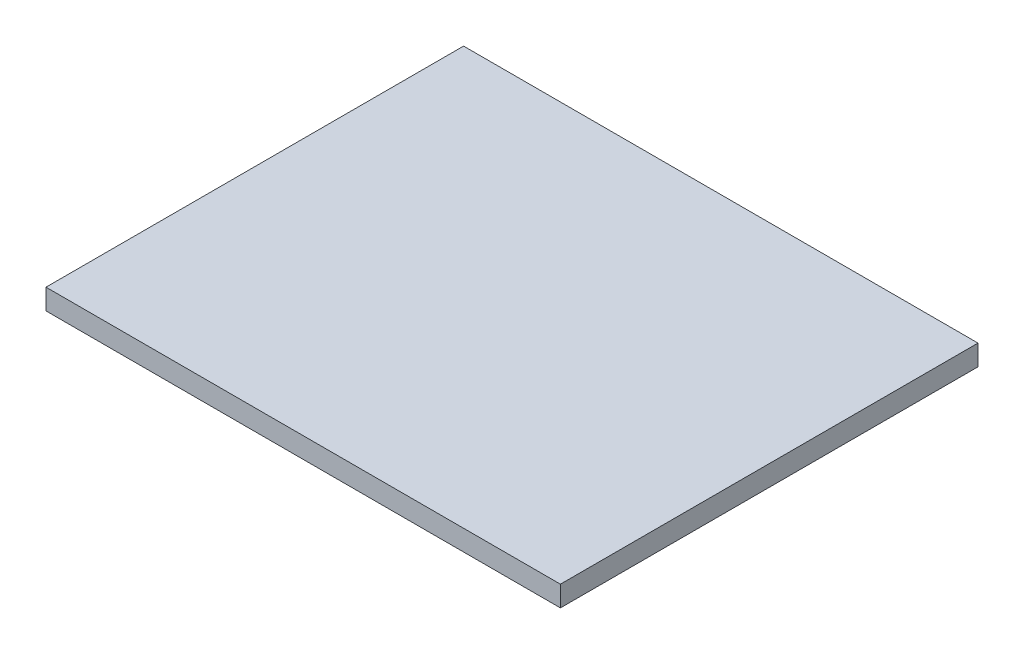
ISO-10303-21;
HEADER;
FILE_DESCRIPTION(('STEP AP214'),'2;1');
FILE_NAME('part.step','',(''),(''),'','','');
FILE_SCHEMA(('AUTOMOTIVE_DESIGN { 1 0 10303 214 1 1 1 1 }'));
ENDSEC;
DATA;
#1=APPLICATION_CONTEXT('core data for automotive mechanical design processes');
#2=APPLICATION_PROTOCOL_DEFINITION('international standard','automotive_design',2000,#1);
#3=PRODUCT_CONTEXT('',#1,'mechanical');
#4=PRODUCT('Part','Part','',(#3));
#5=PRODUCT_RELATED_PRODUCT_CATEGORY('part','',(#4));
#6=PRODUCT_DEFINITION_FORMATION('','',#4);
#7=PRODUCT_DEFINITION_CONTEXT('part definition',#1,'design');
#8=PRODUCT_DEFINITION('design','',#6,#7);
#9=PRODUCT_DEFINITION_SHAPE('','',#8);
#10=(LENGTH_UNIT() NAMED_UNIT(*) SI_UNIT(.MILLI.,.METRE.));
#11=(NAMED_UNIT(*) PLANE_ANGLE_UNIT() SI_UNIT($,.RADIAN.));
#12=(NAMED_UNIT(*) SI_UNIT($,.STERADIAN.) SOLID_ANGLE_UNIT());
#13=UNCERTAINTY_MEASURE_WITH_UNIT(LENGTH_MEASURE(1.E-05),#10,'distance_accuracy_value','');
#14=(GEOMETRIC_REPRESENTATION_CONTEXT(3) GLOBAL_UNCERTAINTY_ASSIGNED_CONTEXT((#13)) GLOBAL_UNIT_ASSIGNED_CONTEXT((#10,
#11,#12)) REPRESENTATION_CONTEXT('',''));
#15=CARTESIAN_POINT('',(0.,0.,0.));
#16=DIRECTION('',(0.,0.,1.));
#17=DIRECTION('',(1.,0.,0.));
#18=AXIS2_PLACEMENT_3D('',#15,#16,#17);
#19=CARTESIAN_POINT('',(212.5,17.,-172.5));
#20=DIRECTION('',(-1.,0.,0.));
#21=DIRECTION('',(0.,0.,1.));
#22=AXIS2_PLACEMENT_3D('',#19,#20,#21);
#23=PLANE('',#22);
#24=DIRECTION('',(0.,0.,-1.));
#25=VECTOR('',#24,1.);
#26=CARTESIAN_POINT('',(212.5,0.,-172.5));
#27=LINE('',#26,#25);
#28=CARTESIAN_POINT('',(212.5,0.,172.5));
#29=VERTEX_POINT('',#28);
#30=CARTESIAN_POINT('',(212.5,0.,-172.5));
#31=VERTEX_POINT('',#30);
#32=EDGE_CURVE('E107',#29,#31,#27,.T.);
#33=ORIENTED_EDGE('',*,*,#32,.T.);
#34=DIRECTION('',(0.,-1.,0.));
#35=VECTOR('',#34,1.);
#36=CARTESIAN_POINT('',(212.5,17.,-172.5));
#37=LINE('',#36,#35);
#38=CARTESIAN_POINT('',(212.5,17.,-172.5));
#39=VERTEX_POINT('',#38);
#40=EDGE_CURVE('E11',#39,#31,#37,.T.);
#41=ORIENTED_EDGE('',*,*,#40,.F.);
#42=DIRECTION('',(0.,0.,-1.));
#43=VECTOR('',#42,1.);
#44=CARTESIAN_POINT('',(212.5,17.,-172.5));
#45=LINE('',#44,#43);
#46=CARTESIAN_POINT('',(212.5,17.,172.5));
#47=VERTEX_POINT('',#46);
#48=EDGE_CURVE('E91',#47,#39,#45,.T.);
#49=ORIENTED_EDGE('',*,*,#48,.F.);
#50=DIRECTION('',(0.,-1.,0.));
#51=VECTOR('',#50,1.);
#52=CARTESIAN_POINT('',(212.5,17.,172.5));
#53=LINE('',#52,#51);
#54=EDGE_CURVE('E103',#47,#29,#53,.T.);
#55=ORIENTED_EDGE('',*,*,#54,.T.);
#56=EDGE_LOOP('',(#33,#41,#49,#55));
#57=FACE_BOUND('',#56,.T.);
#58=ADVANCED_FACE('F39',(#57),#23,.F.);
#59=CARTESIAN_POINT('',(-212.5,17.,-172.5));
#60=DIRECTION('',(0.,0.,1.));
#61=DIRECTION('',(1.,0.,0.));
#62=AXIS2_PLACEMENT_3D('',#59,#60,#61);
#63=PLANE('',#62);
#64=DIRECTION('',(-1.,0.,0.));
#65=VECTOR('',#64,1.);
#66=CARTESIAN_POINT('',(-212.5,0.,-172.5));
#67=LINE('',#66,#65);
#68=CARTESIAN_POINT('',(-212.5,0.,-172.5));
#69=VERTEX_POINT('',#68);
#70=EDGE_CURVE('E96',#31,#69,#67,.T.);
#71=ORIENTED_EDGE('',*,*,#70,.T.);
#72=DIRECTION('',(0.,-1.,0.));
#73=VECTOR('',#72,1.);
#74=CARTESIAN_POINT('',(-212.5,17.,-172.5));
#75=LINE('',#74,#73);
#76=CARTESIAN_POINT('',(-212.5,17.,-172.5));
#77=VERTEX_POINT('',#76);
#78=EDGE_CURVE('E48',#77,#69,#75,.T.);
#79=ORIENTED_EDGE('',*,*,#78,.F.);
#80=DIRECTION('',(-1.,0.,0.));
#81=VECTOR('',#80,1.);
#82=CARTESIAN_POINT('',(-212.5,17.,-172.5));
#83=LINE('',#82,#81);
#84=EDGE_CURVE('E86',#39,#77,#83,.T.);
#85=ORIENTED_EDGE('',*,*,#84,.F.);
#86=ORIENTED_EDGE('',*,*,#40,.T.);
#87=EDGE_LOOP('',(#71,#79,#85,#86));
#88=FACE_BOUND('',#87,.T.);
#89=ADVANCED_FACE('F95',(#88),#63,.F.);
#90=CARTESIAN_POINT('',(-212.5,17.,-172.5));
#91=DIRECTION('',(1.,0.,0.));
#92=DIRECTION('',(0.,0.,-1.));
#93=AXIS2_PLACEMENT_3D('',#90,#91,#92);
#94=PLANE('',#93);
#95=DIRECTION('',(0.,0.,1.));
#96=VECTOR('',#95,1.);
#97=CARTESIAN_POINT('',(-212.5,0.,-172.5));
#98=LINE('',#97,#96);
#99=CARTESIAN_POINT('',(-212.5,0.,172.5));
#100=VERTEX_POINT('',#99);
#101=EDGE_CURVE('E73',#69,#100,#98,.T.);
#102=ORIENTED_EDGE('',*,*,#101,.T.);
#103=DIRECTION('',(0.,-1.,0.));
#104=VECTOR('',#103,1.);
#105=CARTESIAN_POINT('',(-212.5,17.,172.5));
#106=LINE('',#105,#104);
#107=CARTESIAN_POINT('',(-212.5,17.,172.5));
#108=VERTEX_POINT('',#107);
#109=EDGE_CURVE('E98',#108,#100,#106,.T.);
#110=ORIENTED_EDGE('',*,*,#109,.F.);
#111=DIRECTION('',(0.,0.,1.));
#112=VECTOR('',#111,1.);
#113=CARTESIAN_POINT('',(-212.5,17.,-172.5));
#114=LINE('',#113,#112);
#115=EDGE_CURVE('E89',#77,#108,#114,.T.);
#116=ORIENTED_EDGE('',*,*,#115,.F.);
#117=ORIENTED_EDGE('',*,*,#78,.T.);
#118=EDGE_LOOP('',(#102,#110,#116,#117));
#119=FACE_BOUND('',#118,.T.);
#120=ADVANCED_FACE('F99',(#119),#94,.F.);
#121=CARTESIAN_POINT('',(-212.5,17.,172.5));
#122=DIRECTION('',(0.,0.,-1.));
#123=DIRECTION('',(-1.,0.,0.));
#124=AXIS2_PLACEMENT_3D('',#121,#122,#123);
#125=PLANE('',#124);
#126=DIRECTION('',(1.,0.,0.));
#127=VECTOR('',#126,1.);
#128=CARTESIAN_POINT('',(-212.5,0.,172.5));
#129=LINE('',#128,#127);
#130=EDGE_CURVE('E79',#100,#29,#129,.T.);
#131=ORIENTED_EDGE('',*,*,#130,.T.);
#132=ORIENTED_EDGE('',*,*,#54,.F.);
#133=DIRECTION('',(1.,0.,0.));
#134=VECTOR('',#133,1.);
#135=CARTESIAN_POINT('',(-212.5,17.,172.5));
#136=LINE('',#135,#134);
#137=EDGE_CURVE('E56',#108,#47,#136,.T.);
#138=ORIENTED_EDGE('',*,*,#137,.F.);
#139=ORIENTED_EDGE('',*,*,#109,.T.);
#140=EDGE_LOOP('',(#131,#132,#138,#139));
#141=FACE_BOUND('',#140,.T.);
#142=ADVANCED_FACE('F120',(#141),#125,.F.);
#143=CARTESIAN_POINT('',(0.,17.,0.));
#144=DIRECTION('',(0.,1.,0.));
#145=DIRECTION('',(0.,0.,1.));
#146=AXIS2_PLACEMENT_3D('',#143,#144,#145);
#147=PLANE('',#146);
#148=ORIENTED_EDGE('',*,*,#48,.T.);
#149=ORIENTED_EDGE('',*,*,#84,.T.);
#150=ORIENTED_EDGE('',*,*,#115,.T.);
#151=ORIENTED_EDGE('',*,*,#137,.T.);
#152=EDGE_LOOP('',(#148,#149,#150,#151));
#153=FACE_BOUND('',#152,.T.);
#154=ADVANCED_FACE('F87',(#153),#147,.T.);
#155=CARTESIAN_POINT('',(0.,0.,0.));
#156=DIRECTION('',(0.,1.,0.));
#157=DIRECTION('',(0.,0.,1.));
#158=AXIS2_PLACEMENT_3D('',#155,#156,#157);
#159=PLANE('',#158);
#160=ORIENTED_EDGE('',*,*,#32,.F.);
#161=ORIENTED_EDGE('',*,*,#130,.F.);
#162=ORIENTED_EDGE('',*,*,#101,.F.);
#163=ORIENTED_EDGE('',*,*,#70,.F.);
#164=EDGE_LOOP('',(#160,#161,#162,#163));
#165=FACE_BOUND('',#164,.T.);
#166=ADVANCED_FACE('F123',(#165),#159,.F.);
#167=CLOSED_SHELL('',(#58,#89,#120,#142,#154,#166));
#168=MANIFOLD_SOLID_BREP('B2',#167);
#169=ADVANCED_BREP_SHAPE_REPRESENTATION('',(#18,#168),#14);
#170=SHAPE_DEFINITION_REPRESENTATION(#9,#169);
ENDSEC;
END-ISO-10303-21;
